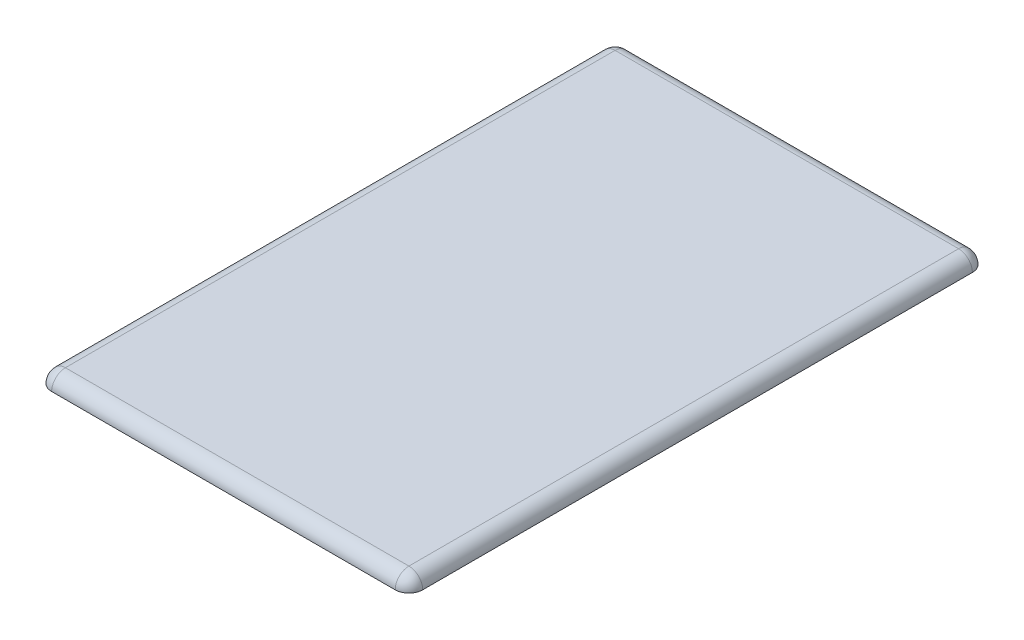
ISO-10303-21;
HEADER;
FILE_DESCRIPTION(('STEP AP214'),'2;1');
FILE_NAME('part.step','',(''),(''),'','','');
FILE_SCHEMA(('AUTOMOTIVE_DESIGN { 1 0 10303 214 1 1 1 1 }'));
ENDSEC;
DATA;
#1=APPLICATION_CONTEXT('core data for automotive mechanical design processes');
#2=APPLICATION_PROTOCOL_DEFINITION('international standard','automotive_design',2000,#1);
#3=PRODUCT_CONTEXT('',#1,'mechanical');
#4=PRODUCT('Part','Part','',(#3));
#5=PRODUCT_RELATED_PRODUCT_CATEGORY('part','',(#4));
#6=PRODUCT_DEFINITION_FORMATION('','',#4);
#7=PRODUCT_DEFINITION_CONTEXT('part definition',#1,'design');
#8=PRODUCT_DEFINITION('design','',#6,#7);
#9=PRODUCT_DEFINITION_SHAPE('','',#8);
#10=(LENGTH_UNIT() NAMED_UNIT(*) SI_UNIT(.MILLI.,.METRE.));
#11=(NAMED_UNIT(*) PLANE_ANGLE_UNIT() SI_UNIT($,.RADIAN.));
#12=(NAMED_UNIT(*) SI_UNIT($,.STERADIAN.) SOLID_ANGLE_UNIT());
#13=UNCERTAINTY_MEASURE_WITH_UNIT(LENGTH_MEASURE(1.E-05),#10,'distance_accuracy_value','');
#14=(GEOMETRIC_REPRESENTATION_CONTEXT(3) GLOBAL_UNCERTAINTY_ASSIGNED_CONTEXT((#13)) GLOBAL_UNIT_ASSIGNED_CONTEXT((#10,
#11,#12)) REPRESENTATION_CONTEXT('',''));
#15=CARTESIAN_POINT('',(0.,0.,0.));
#16=DIRECTION('',(0.,0.,1.));
#17=DIRECTION('',(1.,0.,0.));
#18=AXIS2_PLACEMENT_3D('',#15,#16,#17);
#19=CARTESIAN_POINT('',(-7.08433339327624,0.8,-28.9500362666961));
#20=DIRECTION('',(1.,0.,0.));
#21=DIRECTION('',(0.,0.,-1.));
#22=AXIS2_PLACEMENT_3D('',#19,#20,#21);
#23=PLANE('',#22);
#24=DIRECTION('',(0.,0.,1.));
#25=VECTOR('',#24,1.);
#26=CARTESIAN_POINT('',(-7.08433339327624,0.,-28.9500362666961));
#27=LINE('',#26,#25);
#28=CARTESIAN_POINT('',(-7.08433339327624,0.,-28.9500362666961));
#29=VERTEX_POINT('',#28);
#30=CARTESIAN_POINT('',(-7.08433339327624,0.,10.8499637333038));
#31=VERTEX_POINT('',#30);
#32=EDGE_CURVE('E139',#29,#31,#27,.T.);
#33=ORIENTED_EDGE('',*,*,#32,.T.);
#34=DIRECTION('',(0.,-1.,0.));
#35=VECTOR('',#34,1.);
#36=CARTESIAN_POINT('',(-7.08433339327624,0.8,10.8499637333038));
#37=LINE('',#36,#35);
#38=CARTESIAN_POINT('',(-7.08433339327624,0.8,10.8499637333038));
#39=VERTEX_POINT('',#38);
#40=EDGE_CURVE('E116',#39,#31,#37,.T.);
#41=ORIENTED_EDGE('',*,*,#40,.F.);
#42=DIRECTION('',(0.,0.,1.));
#43=VECTOR('',#42,1.);
#44=CARTESIAN_POINT('',(-7.08433339327624,0.8,-28.9500362666961));
#45=LINE('',#44,#43);
#46=CARTESIAN_POINT('',(-7.08433339327624,0.8,-28.9500362666961));
#47=VERTEX_POINT('',#46);
#48=EDGE_CURVE('E110',#47,#39,#45,.T.);
#49=ORIENTED_EDGE('',*,*,#48,.F.);
#50=DIRECTION('',(0.,-1.,0.));
#51=VECTOR('',#50,1.);
#52=CARTESIAN_POINT('',(-7.08433339327624,0.8,-28.9500362666961));
#53=LINE('',#52,#51);
#54=EDGE_CURVE('E113',#47,#29,#53,.T.);
#55=ORIENTED_EDGE('',*,*,#54,.T.);
#56=EDGE_LOOP('',(#33,#41,#49,#55));
#57=FACE_BOUND('',#56,.T.);
#58=ADVANCED_FACE('F33',(#57),#23,.F.);
#59=CARTESIAN_POINT('',(-7.08433339327624,0.8,10.8499637333038));
#60=DIRECTION('',(0.,0.,-1.));
#61=DIRECTION('',(-1.,0.,0.));
#62=AXIS2_PLACEMENT_3D('',#59,#60,#61);
#63=PLANE('',#62);
#64=DIRECTION('',(1.,0.,0.));
#65=VECTOR('',#64,1.);
#66=CARTESIAN_POINT('',(-7.08433339327624,0.,10.8499637333038));
#67=LINE('',#66,#65);
#68=CARTESIAN_POINT('',(17.7156666067238,0.,10.8499637333038));
#69=VERTEX_POINT('',#68);
#70=EDGE_CURVE('E141',#31,#69,#67,.T.);
#71=ORIENTED_EDGE('',*,*,#70,.T.);
#72=DIRECTION('',(0.,-1.,0.));
#73=VECTOR('',#72,1.);
#74=CARTESIAN_POINT('',(17.7156666067238,0.8,10.8499637333038));
#75=LINE('',#74,#73);
#76=CARTESIAN_POINT('',(17.7156666067238,0.8,10.8499637333038));
#77=VERTEX_POINT('',#76);
#78=EDGE_CURVE('E148',#77,#69,#75,.T.);
#79=ORIENTED_EDGE('',*,*,#78,.F.);
#80=DIRECTION('',(1.,0.,0.));
#81=VECTOR('',#80,1.);
#82=CARTESIAN_POINT('',(-7.08433339327624,0.8,10.8499637333038));
#83=LINE('',#82,#81);
#84=EDGE_CURVE('E120',#39,#77,#83,.T.);
#85=ORIENTED_EDGE('',*,*,#84,.F.);
#86=ORIENTED_EDGE('',*,*,#40,.T.);
#87=EDGE_LOOP('',(#71,#79,#85,#86));
#88=FACE_BOUND('',#87,.T.);
#89=ADVANCED_FACE('F203',(#88),#63,.F.);
#90=CARTESIAN_POINT('',(17.7156666067238,0.8,-28.9500362666961));
#91=DIRECTION('',(-1.,0.,0.));
#92=DIRECTION('',(0.,0.,1.));
#93=AXIS2_PLACEMENT_3D('',#90,#91,#92);
#94=PLANE('',#93);
#95=DIRECTION('',(0.,0.,-1.));
#96=VECTOR('',#95,1.);
#97=CARTESIAN_POINT('',(17.7156666067238,0.,-28.9500362666961));
#98=LINE('',#97,#96);
#99=CARTESIAN_POINT('',(17.7156666067238,0.,-28.9500362666961));
#100=VERTEX_POINT('',#99);
#101=EDGE_CURVE('E144',#69,#100,#98,.T.);
#102=ORIENTED_EDGE('',*,*,#101,.T.);
#103=DIRECTION('',(0.,-1.,0.));
#104=VECTOR('',#103,1.);
#105=CARTESIAN_POINT('',(17.7156666067238,0.8,-28.9500362666961));
#106=LINE('',#105,#104);
#107=CARTESIAN_POINT('',(17.7156666067238,0.8,-28.9500362666961));
#108=VERTEX_POINT('',#107);
#109=EDGE_CURVE('E130',#108,#100,#106,.T.);
#110=ORIENTED_EDGE('',*,*,#109,.F.);
#111=DIRECTION('',(0.,0.,-1.));
#112=VECTOR('',#111,1.);
#113=CARTESIAN_POINT('',(17.7156666067238,0.8,-28.9500362666961));
#114=LINE('',#113,#112);
#115=EDGE_CURVE('E134',#77,#108,#114,.T.);
#116=ORIENTED_EDGE('',*,*,#115,.F.);
#117=ORIENTED_EDGE('',*,*,#78,.T.);
#118=EDGE_LOOP('',(#102,#110,#116,#117));
#119=FACE_BOUND('',#118,.T.);
#120=ADVANCED_FACE('F206',(#119),#94,.F.);
#121=CARTESIAN_POINT('',(-7.08433339327624,0.8,-28.9500362666961));
#122=DIRECTION('',(0.,0.,1.));
#123=DIRECTION('',(1.,0.,0.));
#124=AXIS2_PLACEMENT_3D('',#121,#122,#123);
#125=PLANE('',#124);
#126=DIRECTION('',(-1.,0.,0.));
#127=VECTOR('',#126,1.);
#128=CARTESIAN_POINT('',(-7.08433339327624,0.,-28.9500362666961));
#129=LINE('',#128,#127);
#130=EDGE_CURVE('E121',#100,#29,#129,.T.);
#131=ORIENTED_EDGE('',*,*,#130,.T.);
#132=ORIENTED_EDGE('',*,*,#54,.F.);
#133=DIRECTION('',(-1.,0.,0.));
#134=VECTOR('',#133,1.);
#135=CARTESIAN_POINT('',(-7.08433339327624,0.8,-28.9500362666961));
#136=LINE('',#135,#134);
#137=EDGE_CURVE('E127',#108,#47,#136,.T.);
#138=ORIENTED_EDGE('',*,*,#137,.F.);
#139=ORIENTED_EDGE('',*,*,#109,.T.);
#140=EDGE_LOOP('',(#131,#132,#138,#139));
#141=FACE_BOUND('',#140,.T.);
#142=ADVANCED_FACE('F125',(#141),#125,.F.);
#143=CARTESIAN_POINT('',(0.,0.,0.));
#144=DIRECTION('',(0.,1.,0.));
#145=DIRECTION('',(0.,0.,1.));
#146=AXIS2_PLACEMENT_3D('',#143,#144,#145);
#147=PLANE('',#146);
#148=ORIENTED_EDGE('',*,*,#32,.F.);
#149=ORIENTED_EDGE('',*,*,#130,.F.);
#150=ORIENTED_EDGE('',*,*,#101,.F.);
#151=ORIENTED_EDGE('',*,*,#70,.F.);
#152=EDGE_LOOP('',(#148,#149,#150,#151));
#153=FACE_BOUND('',#152,.T.);
#154=ADVANCED_FACE('F208',(#153),#147,.F.);
#155=CARTESIAN_POINT('',(0.,0.8,0.));
#156=DIRECTION('',(0.,1.,0.));
#157=DIRECTION('',(0.,0.,1.));
#158=AXIS2_PLACEMENT_3D('',#155,#156,#157);
#159=PLANE('',#158);
#160=DIRECTION('',(0.,0.,-1.));
#161=VECTOR('',#160,1.);
#162=CARTESIAN_POINT('',(18.8156666067238,0.8,-30.0500362666962));
#163=LINE('',#162,#161);
#164=CARTESIAN_POINT('',(18.8156666067238,0.8,10.9499637333038));
#165=VERTEX_POINT('',#164);
#166=CARTESIAN_POINT('',(18.8156666067238,0.8,-29.0500362666962));
#167=VERTEX_POINT('',#166);
#168=EDGE_CURVE('E196',#165,#167,#163,.T.);
#169=ORIENTED_EDGE('',*,*,#168,.F.);
#170=CARTESIAN_POINT('',(17.8156666067238,0.8,10.9499637333039));
#171=DIRECTION('',(0.,1.,0.));
#172=DIRECTION('',(0.,0.,1.));
#173=AXIS2_PLACEMENT_3D('',#170,#171,#172);
#174=CIRCLE('',#173,1.);
#175=CARTESIAN_POINT('',(17.8156666067238,0.8,11.9499637333039));
#176=VERTEX_POINT('',#175);
#177=EDGE_CURVE('E11',#165,#176,#174,.F.);
#178=ORIENTED_EDGE('',*,*,#177,.T.);
#179=DIRECTION('',(1.,0.,0.));
#180=VECTOR('',#179,1.);
#181=CARTESIAN_POINT('',(-8.18433339327624,0.8,11.9499637333039));
#182=LINE('',#181,#180);
#183=CARTESIAN_POINT('',(-7.18433339327624,0.8,11.9499637333039));
#184=VERTEX_POINT('',#183);
#185=EDGE_CURVE('E53',#184,#176,#182,.T.);
#186=ORIENTED_EDGE('',*,*,#185,.F.);
#187=CARTESIAN_POINT('',(-7.18433339327624,0.8,10.9499637333039));
#188=DIRECTION('',(0.,1.,0.));
#189=DIRECTION('',(0.,0.,1.));
#190=AXIS2_PLACEMENT_3D('',#187,#188,#189);
#191=CIRCLE('',#190,1.);
#192=CARTESIAN_POINT('',(-8.18433339327624,0.8,10.9499637333038));
#193=VERTEX_POINT('',#192);
#194=EDGE_CURVE('E42',#184,#193,#191,.F.);
#195=ORIENTED_EDGE('',*,*,#194,.T.);
#196=DIRECTION('',(0.,0.,1.));
#197=VECTOR('',#196,1.);
#198=CARTESIAN_POINT('',(-8.18433339327624,0.8,-30.0500362666962));
#199=LINE('',#198,#197);
#200=CARTESIAN_POINT('',(-8.18433339327624,0.8,-29.0500362666962));
#201=VERTEX_POINT('',#200);
#202=EDGE_CURVE('E186',#201,#193,#199,.T.);
#203=ORIENTED_EDGE('',*,*,#202,.F.);
#204=CARTESIAN_POINT('',(-7.18433339327624,0.8,-29.0500362666962));
#205=DIRECTION('',(0.,1.,0.));
#206=DIRECTION('',(0.,0.,1.));
#207=AXIS2_PLACEMENT_3D('',#204,#205,#206);
#208=CIRCLE('',#207,1.);
#209=CARTESIAN_POINT('',(-7.18433339327624,0.8,-30.0500362666962));
#210=VERTEX_POINT('',#209);
#211=EDGE_CURVE('E163',#201,#210,#208,.F.);
#212=ORIENTED_EDGE('',*,*,#211,.T.);
#213=DIRECTION('',(-1.,0.,0.));
#214=VECTOR('',#213,1.);
#215=CARTESIAN_POINT('',(-8.18433339327624,0.8,-30.0500362666962));
#216=LINE('',#215,#214);
#217=CARTESIAN_POINT('',(17.8156666067238,0.8,-30.0500362666962));
#218=VERTEX_POINT('',#217);
#219=EDGE_CURVE('E142',#218,#210,#216,.T.);
#220=ORIENTED_EDGE('',*,*,#219,.F.);
#221=CARTESIAN_POINT('',(17.8156666067238,0.8,-29.0500362666962));
#222=DIRECTION('',(0.,1.,0.));
#223=DIRECTION('',(0.,0.,1.));
#224=AXIS2_PLACEMENT_3D('',#221,#222,#223);
#225=CIRCLE('',#224,1.);
#226=EDGE_CURVE('E161',#218,#167,#225,.F.);
#227=ORIENTED_EDGE('',*,*,#226,.T.);
#228=EDGE_LOOP('',(#169,#178,#186,#195,#203,#212,#220,#227));
#229=FACE_BOUND('',#228,.T.);
#230=ORIENTED_EDGE('',*,*,#137,.T.);
#231=ORIENTED_EDGE('',*,*,#48,.T.);
#232=ORIENTED_EDGE('',*,*,#84,.T.);
#233=ORIENTED_EDGE('',*,*,#115,.T.);
#234=EDGE_LOOP('',(#230,#231,#232,#233));
#235=FACE_BOUND('',#234,.T.);
#236=ADVANCED_FACE('F132',(#229,#235),#159,.F.);
#237=CARTESIAN_POINT('',(0.,1.8,0.));
#238=DIRECTION('',(0.,1.,0.));
#239=DIRECTION('',(0.,0.,1.));
#240=AXIS2_PLACEMENT_3D('',#237,#238,#239);
#241=PLANE('',#240);
#242=DIRECTION('',(-1.,0.,0.));
#243=VECTOR('',#242,1.);
#244=CARTESIAN_POINT('',(-8.18433339327624,1.8,-29.0500362666962));
#245=LINE('',#244,#243);
#246=CARTESIAN_POINT('',(17.8156666067238,1.8,-29.0500362666962));
#247=VERTEX_POINT('',#246);
#248=CARTESIAN_POINT('',(-7.18433339327624,1.8,-29.0500362666962));
#249=VERTEX_POINT('',#248);
#250=EDGE_CURVE('E156',#247,#249,#245,.T.);
#251=ORIENTED_EDGE('',*,*,#250,.T.);
#252=DIRECTION('',(0.,0.,1.));
#253=VECTOR('',#252,1.);
#254=CARTESIAN_POINT('',(-7.18433339327624,1.8,11.9499637333039));
#255=LINE('',#254,#253);
#256=CARTESIAN_POINT('',(-7.18433339327624,1.8,10.9499637333039));
#257=VERTEX_POINT('',#256);
#258=EDGE_CURVE('E158',#249,#257,#255,.T.);
#259=ORIENTED_EDGE('',*,*,#258,.T.);
#260=DIRECTION('',(1.,0.,0.));
#261=VECTOR('',#260,1.);
#262=CARTESIAN_POINT('',(18.8156666067238,1.8,10.9499637333039));
#263=LINE('',#262,#261);
#264=CARTESIAN_POINT('',(17.8156666067238,1.8,10.9499637333039));
#265=VERTEX_POINT('',#264);
#266=EDGE_CURVE('E152',#257,#265,#263,.T.);
#267=ORIENTED_EDGE('',*,*,#266,.T.);
#268=DIRECTION('',(0.,0.,-1.));
#269=VECTOR('',#268,1.);
#270=CARTESIAN_POINT('',(17.8156666067238,1.8,-30.0500362666962));
#271=LINE('',#270,#269);
#272=EDGE_CURVE('E154',#265,#247,#271,.T.);
#273=ORIENTED_EDGE('',*,*,#272,.T.);
#274=EDGE_LOOP('',(#251,#259,#267,#273));
#275=FACE_BOUND('',#274,.T.);
#276=ADVANCED_FACE('F215',(#275),#241,.T.);
#277=CARTESIAN_POINT('',(17.8156666067238,0.8,0.));
#278=DIRECTION('',(0.,0.,1.));
#279=DIRECTION('',(1.,0.,0.));
#280=AXIS2_PLACEMENT_3D('',#277,#278,#279);
#281=CYLINDRICAL_SURFACE('',#280,1.);
#282=CARTESIAN_POINT('',(17.8156666067238,0.8,10.9499637333039));
#283=DIRECTION('',(0.,0.,1.));
#284=DIRECTION('',(1.,0.,0.));
#285=AXIS2_PLACEMENT_3D('',#282,#283,#284);
#286=CIRCLE('',#285,1.);
#287=EDGE_CURVE('E181',#165,#265,#286,.T.);
#288=ORIENTED_EDGE('',*,*,#287,.F.);
#289=ORIENTED_EDGE('',*,*,#168,.T.);
#290=CARTESIAN_POINT('',(17.8156666067238,0.8,-29.0500362666962));
#291=DIRECTION('',(0.,0.,-1.));
#292=DIRECTION('',(-1.,0.,0.));
#293=AXIS2_PLACEMENT_3D('',#290,#291,#292);
#294=CIRCLE('',#293,1.);
#295=EDGE_CURVE('E37',#247,#167,#294,.T.);
#296=ORIENTED_EDGE('',*,*,#295,.F.);
#297=ORIENTED_EDGE('',*,*,#272,.F.);
#298=EDGE_LOOP('',(#288,#289,#296,#297));
#299=FACE_BOUND('',#298,.T.);
#300=ADVANCED_FACE('F35',(#299),#281,.T.);
#301=CARTESIAN_POINT('',(17.8156666067238,0.8,-29.0500362666962));
#302=DIRECTION('',(0.,0.,1.));
#303=DIRECTION('',(1.,0.,0.));
#304=AXIS2_PLACEMENT_3D('',#301,#302,#303);
#305=SPHERICAL_SURFACE('',#304,1.);
#306=ORIENTED_EDGE('',*,*,#295,.T.);
#307=ORIENTED_EDGE('',*,*,#226,.F.);
#308=CARTESIAN_POINT('',(17.8156666067238,0.8,-29.0500362666962));
#309=DIRECTION('',(1.,0.,0.));
#310=DIRECTION('',(0.,0.,-1.));
#311=AXIS2_PLACEMENT_3D('',#308,#309,#310);
#312=CIRCLE('',#311,1.);
#313=EDGE_CURVE('E179',#247,#218,#312,.F.);
#314=ORIENTED_EDGE('',*,*,#313,.F.);
#315=EDGE_LOOP('',(#306,#307,#314));
#316=FACE_BOUND('',#315,.T.);
#317=ADVANCED_FACE('F247',(#316),#305,.T.);
#318=CARTESIAN_POINT('',(17.8156666067238,0.8,10.9499637333039));
#319=DIRECTION('',(0.,0.,1.));
#320=DIRECTION('',(1.,0.,0.));
#321=AXIS2_PLACEMENT_3D('',#318,#319,#320);
#322=SPHERICAL_SURFACE('',#321,1.);
#323=ORIENTED_EDGE('',*,*,#177,.F.);
#324=ORIENTED_EDGE('',*,*,#287,.T.);
#325=CARTESIAN_POINT('',(17.8156666067238,0.8,10.9499637333039));
#326=DIRECTION('',(1.,0.,0.));
#327=DIRECTION('',(0.,0.,-1.));
#328=AXIS2_PLACEMENT_3D('',#325,#326,#327);
#329=CIRCLE('',#328,1.);
#330=EDGE_CURVE('E176',#176,#265,#329,.F.);
#331=ORIENTED_EDGE('',*,*,#330,.F.);
#332=EDGE_LOOP('',(#323,#324,#331));
#333=FACE_BOUND('',#332,.T.);
#334=ADVANCED_FACE('F244',(#333),#322,.T.);
#335=CARTESIAN_POINT('',(0.,0.8,-29.0500362666962));
#336=DIRECTION('',(1.,0.,0.));
#337=DIRECTION('',(0.,0.,-1.));
#338=AXIS2_PLACEMENT_3D('',#335,#336,#337);
#339=CYLINDRICAL_SURFACE('',#338,1.);
#340=ORIENTED_EDGE('',*,*,#313,.T.);
#341=ORIENTED_EDGE('',*,*,#219,.T.);
#342=CARTESIAN_POINT('',(-7.18433339327624,0.8,-29.0500362666962));
#343=DIRECTION('',(-1.,0.,0.));
#344=DIRECTION('',(0.,0.,1.));
#345=AXIS2_PLACEMENT_3D('',#342,#343,#344);
#346=CIRCLE('',#345,1.);
#347=EDGE_CURVE('E173',#249,#210,#346,.T.);
#348=ORIENTED_EDGE('',*,*,#347,.F.);
#349=ORIENTED_EDGE('',*,*,#250,.F.);
#350=EDGE_LOOP('',(#340,#341,#348,#349));
#351=FACE_BOUND('',#350,.T.);
#352=ADVANCED_FACE('F240',(#351),#339,.T.);
#353=CARTESIAN_POINT('',(0.,0.8,10.9499637333039));
#354=DIRECTION('',(-1.,0.,0.));
#355=DIRECTION('',(0.,0.,1.));
#356=AXIS2_PLACEMENT_3D('',#353,#354,#355);
#357=CYLINDRICAL_SURFACE('',#356,1.);
#358=ORIENTED_EDGE('',*,*,#330,.T.);
#359=ORIENTED_EDGE('',*,*,#266,.F.);
#360=CARTESIAN_POINT('',(-7.18433339327624,0.8,10.9499637333039));
#361=DIRECTION('',(-1.,0.,0.));
#362=DIRECTION('',(0.,0.,1.));
#363=AXIS2_PLACEMENT_3D('',#360,#361,#362);
#364=CIRCLE('',#363,1.);
#365=EDGE_CURVE('E170',#184,#257,#364,.T.);
#366=ORIENTED_EDGE('',*,*,#365,.F.);
#367=ORIENTED_EDGE('',*,*,#185,.T.);
#368=EDGE_LOOP('',(#358,#359,#366,#367));
#369=FACE_BOUND('',#368,.T.);
#370=ADVANCED_FACE('F236',(#369),#357,.T.);
#371=CARTESIAN_POINT('',(-7.18433339327624,0.8,-29.0500362666962));
#372=DIRECTION('',(0.,0.,1.));
#373=DIRECTION('',(1.,0.,0.));
#374=AXIS2_PLACEMENT_3D('',#371,#372,#373);
#375=SPHERICAL_SURFACE('',#374,1.);
#376=ORIENTED_EDGE('',*,*,#347,.T.);
#377=ORIENTED_EDGE('',*,*,#211,.F.);
#378=CARTESIAN_POINT('',(-7.18433339327624,0.8,-29.0500362666962));
#379=DIRECTION('',(0.,0.,-1.));
#380=DIRECTION('',(-1.,0.,0.));
#381=AXIS2_PLACEMENT_3D('',#378,#379,#380);
#382=CIRCLE('',#381,1.);
#383=EDGE_CURVE('E168',#249,#201,#382,.F.);
#384=ORIENTED_EDGE('',*,*,#383,.F.);
#385=EDGE_LOOP('',(#376,#377,#384));
#386=FACE_BOUND('',#385,.T.);
#387=ADVANCED_FACE('F232',(#386),#375,.T.);
#388=CARTESIAN_POINT('',(-7.18433339327624,0.8,10.9499637333039));
#389=DIRECTION('',(0.,0.,1.));
#390=DIRECTION('',(1.,0.,0.));
#391=AXIS2_PLACEMENT_3D('',#388,#389,#390);
#392=SPHERICAL_SURFACE('',#391,1.);
#393=ORIENTED_EDGE('',*,*,#194,.F.);
#394=ORIENTED_EDGE('',*,*,#365,.T.);
#395=CARTESIAN_POINT('',(-7.18433339327624,0.8,10.9499637333039));
#396=DIRECTION('',(0.,0.,1.));
#397=DIRECTION('',(1.,0.,0.));
#398=AXIS2_PLACEMENT_3D('',#395,#396,#397);
#399=CIRCLE('',#398,1.);
#400=EDGE_CURVE('E166',#193,#257,#399,.F.);
#401=ORIENTED_EDGE('',*,*,#400,.F.);
#402=EDGE_LOOP('',(#393,#394,#401));
#403=FACE_BOUND('',#402,.T.);
#404=ADVANCED_FACE('F229',(#403),#392,.T.);
#405=CARTESIAN_POINT('',(-7.18433339327624,0.8,0.));
#406=DIRECTION('',(0.,0.,-1.));
#407=DIRECTION('',(-1.,0.,0.));
#408=AXIS2_PLACEMENT_3D('',#405,#406,#407);
#409=CYLINDRICAL_SURFACE('',#408,1.);
#410=ORIENTED_EDGE('',*,*,#383,.T.);
#411=ORIENTED_EDGE('',*,*,#202,.T.);
#412=ORIENTED_EDGE('',*,*,#400,.T.);
#413=ORIENTED_EDGE('',*,*,#258,.F.);
#414=EDGE_LOOP('',(#410,#411,#412,#413));
#415=FACE_BOUND('',#414,.T.);
#416=ADVANCED_FACE('F226',(#415),#409,.T.);
#417=CLOSED_SHELL('',(#58,#89,#120,#142,#154,#236,#276,#300,#317,#334,#352,#370,#387,#404,#416));
#418=MANIFOLD_SOLID_BREP('B2',#417);
#419=ADVANCED_BREP_SHAPE_REPRESENTATION('',(#18,#418),#14);
#420=SHAPE_DEFINITION_REPRESENTATION(#9,#419);
ENDSEC;
END-ISO-10303-21;
